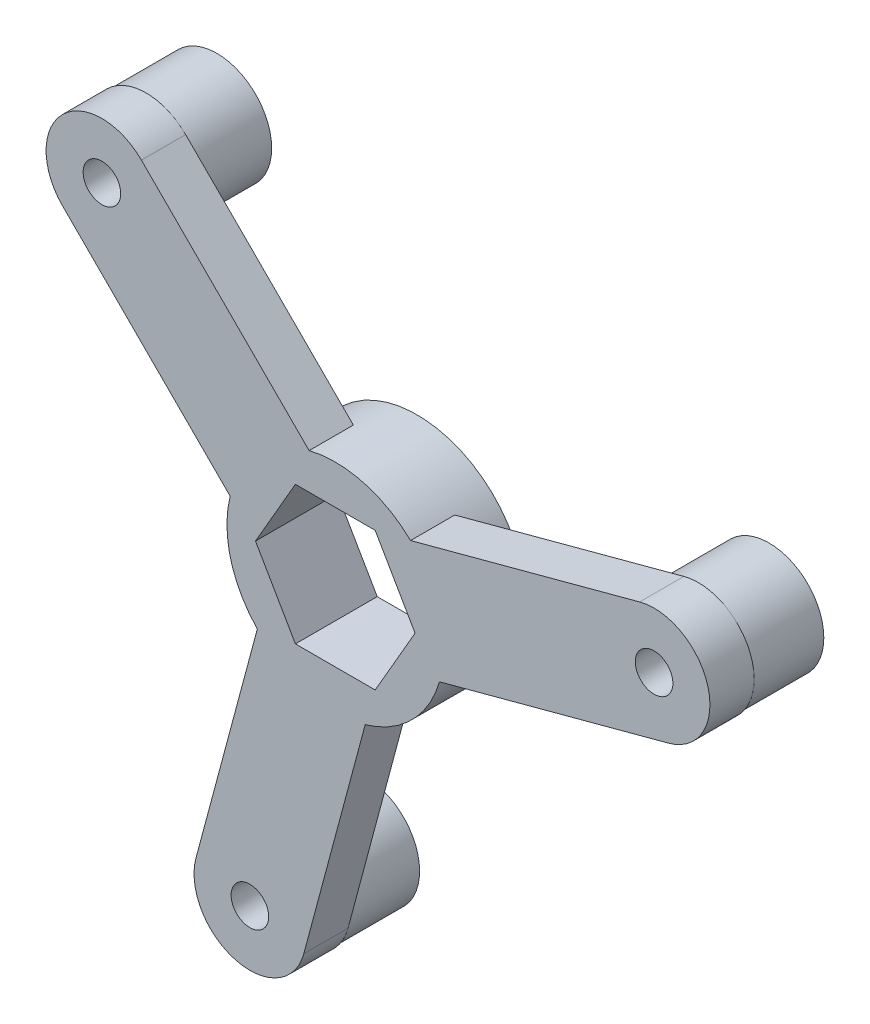
ISO-10303-21;
HEADER;
FILE_DESCRIPTION(('STEP AP214'),'2;1');
FILE_NAME('part.step','',(''),(''),'','','');
FILE_SCHEMA(('AUTOMOTIVE_DESIGN { 1 0 10303 214 1 1 1 1 }'));
ENDSEC;
DATA;
#1=APPLICATION_CONTEXT('core data for automotive mechanical design processes');
#2=APPLICATION_PROTOCOL_DEFINITION('international standard','automotive_design',2000,#1);
#3=PRODUCT_CONTEXT('',#1,'mechanical');
#4=PRODUCT('Part','Part','',(#3));
#5=PRODUCT_RELATED_PRODUCT_CATEGORY('part','',(#4));
#6=PRODUCT_DEFINITION_FORMATION('','',#4);
#7=PRODUCT_DEFINITION_CONTEXT('part definition',#1,'design');
#8=PRODUCT_DEFINITION('design','',#6,#7);
#9=PRODUCT_DEFINITION_SHAPE('','',#8);
#10=(LENGTH_UNIT() NAMED_UNIT(*) SI_UNIT(.MILLI.,.METRE.));
#11=(NAMED_UNIT(*) PLANE_ANGLE_UNIT() SI_UNIT($,.RADIAN.));
#12=(NAMED_UNIT(*) SI_UNIT($,.STERADIAN.) SOLID_ANGLE_UNIT());
#13=UNCERTAINTY_MEASURE_WITH_UNIT(LENGTH_MEASURE(1.E-05),#10,'distance_accuracy_value','');
#14=(GEOMETRIC_REPRESENTATION_CONTEXT(3) GLOBAL_UNCERTAINTY_ASSIGNED_CONTEXT((#13)) GLOBAL_UNIT_ASSIGNED_CONTEXT((#10,
#11,#12)) REPRESENTATION_CONTEXT('',''));
#15=CARTESIAN_POINT('',(0.,0.,0.));
#16=DIRECTION('',(0.,0.,1.));
#17=DIRECTION('',(1.,0.,0.));
#18=AXIS2_PLACEMENT_3D('',#15,#16,#17);
#19=CARTESIAN_POINT('',(0.,0.,10.4));
#20=DIRECTION('',(0.,0.,1.));
#21=DIRECTION('',(1.,0.,0.));
#22=AXIS2_PLACEMENT_3D('',#19,#20,#21);
#23=PLANE('',#22);
#24=CARTESIAN_POINT('',(28.8328859147287,7.72574849631024,10.4));
#25=DIRECTION('',(0.,0.,1.));
#26=DIRECTION('',(1.,0.,0.));
#27=AXIS2_PLACEMENT_3D('',#24,#25,#26);
#28=CIRCLE('',#27,1.7);
#29=CARTESIAN_POINT('',(30.5328859147287,7.72574849631024,10.4));
#30=VERTEX_POINT('',#29);
#31=EDGE_CURVE('E180',#30,#30,#28,.F.);
#32=ORIENTED_EDGE('',*,*,#31,.T.);
#33=EDGE_LOOP('',(#32));
#34=FACE_BOUND('',#33,.T.);
#35=CARTESIAN_POINT('',(-21.1071374184184,21.1071374184184,10.4));
#36=DIRECTION('',(0.,0.,1.));
#37=DIRECTION('',(1.,0.,0.));
#38=AXIS2_PLACEMENT_3D('',#35,#36,#37);
#39=CIRCLE('',#38,1.7);
#40=CARTESIAN_POINT('',(-19.4071374184184,21.1071374184184,10.4));
#41=VERTEX_POINT('',#40);
#42=EDGE_CURVE('E311',#41,#41,#39,.F.);
#43=ORIENTED_EDGE('',*,*,#42,.T.);
#44=EDGE_LOOP('',(#43));
#45=FACE_BOUND('',#44,.T.);
#46=CARTESIAN_POINT('',(-7.72574849631024,-28.8328859147287,10.4));
#47=DIRECTION('',(0.,0.,1.));
#48=DIRECTION('',(1.,0.,0.));
#49=AXIS2_PLACEMENT_3D('',#46,#47,#48);
#50=CIRCLE('',#49,1.7);
#51=CARTESIAN_POINT('',(-6.02574849631024,-28.8328859147287,10.4));
#52=VERTEX_POINT('',#51);
#53=EDGE_CURVE('E308',#52,#52,#50,.F.);
#54=ORIENTED_EDGE('',*,*,#53,.T.);
#55=EDGE_LOOP('',(#54));
#56=FACE_BOUND('',#55,.T.);
#57=CARTESIAN_POINT('',(0.,0.,10.4));
#58=DIRECTION('',(0.,0.,1.));
#59=DIRECTION('',(1.,0.,0.));
#60=AXIS2_PLACEMENT_3D('',#57,#58,#59);
#61=CIRCLE('',#60,9.8);
#62=CARTESIAN_POINT('',(-9.50963911344081,2.36786062345668,10.4));
#63=VERTEX_POINT('',#62);
#64=CARTESIAN_POINT('',(-7.05165874133353,-6.80544700925475,10.4));
#65=VERTEX_POINT('',#64);
#66=EDGE_CURVE('E284',#63,#65,#61,.T.);
#67=ORIENTED_EDGE('',*,*,#66,.T.);
#68=DIRECTION('',(-0.258819045102521,-0.965925826289068,0.));
#69=VECTOR('',#68,1.);
#70=CARTESIAN_POINT('',(-12.60367391907,-27.525849736961,10.4));
#71=LINE('',#70,#69);
#72=CARTESIAN_POINT('',(-12.60367391907,-27.525849736961,10.4));
#73=VERTEX_POINT('',#72);
#74=EDGE_CURVE('E191',#65,#73,#71,.T.);
#75=ORIENTED_EDGE('',*,*,#74,.T.);
#76=CARTESIAN_POINT('',(-7.72574849631024,-28.8328859147287,10.4));
#77=DIRECTION('',(0.,0.,1.));
#78=DIRECTION('',(-1.,0.,0.));
#79=AXIS2_PLACEMENT_3D('',#76,#77,#78);
#80=CIRCLE('',#79,5.05);
#81=CARTESIAN_POINT('',(-2.84782307355045,-30.1399220924964,10.4));
#82=VERTEX_POINT('',#81);
#83=EDGE_CURVE('E196',#73,#82,#80,.T.);
#84=ORIENTED_EDGE('',*,*,#83,.T.);
#85=DIRECTION('',(0.258819045102521,0.965925826289068,0.));
#86=VECTOR('',#85,1.);
#87=CARTESIAN_POINT('',(2.94648829868223,-8.5152576564499,10.4));
#88=LINE('',#87,#86);
#89=CARTESIAN_POINT('',(2.70419210418606,-9.41951936479021,10.4));
#90=VERTEX_POINT('',#89);
#91=EDGE_CURVE('E198',#82,#90,#88,.T.);
#92=ORIENTED_EDGE('',*,*,#91,.T.);
#93=CARTESIAN_POINT('',(9.41951936479022,-2.70419210418606,10.4));
#94=VERTEX_POINT('',#93);
#95=EDGE_CURVE('E288',#90,#94,#61,.T.);
#96=ORIENTED_EDGE('',*,*,#95,.T.);
#97=DIRECTION('',(0.965925826289068,0.258819045102521,0.));
#98=VECTOR('',#97,1.);
#99=CARTESIAN_POINT('',(30.1399220924964,2.84782307355045,10.4));
#100=LINE('',#99,#98);
#101=CARTESIAN_POINT('',(30.1399220924964,2.84782307355045,10.4));
#102=VERTEX_POINT('',#101);
#103=EDGE_CURVE('E257',#94,#102,#100,.T.);
#104=ORIENTED_EDGE('',*,*,#103,.T.);
#105=CARTESIAN_POINT('',(28.8328859147287,7.72574849631025,10.4));
#106=DIRECTION('',(0.,0.,1.));
#107=DIRECTION('',(-1.,0.,0.));
#108=AXIS2_PLACEMENT_3D('',#105,#106,#107);
#109=CIRCLE('',#108,5.05);
#110=CARTESIAN_POINT('',(27.525849736961,12.60367391907,10.4));
#111=VERTEX_POINT('',#110);
#112=EDGE_CURVE('E259',#102,#111,#109,.T.);
#113=ORIENTED_EDGE('',*,*,#112,.T.);
#114=DIRECTION('',(-0.965925826289068,-0.258819045102521,0.));
#115=VECTOR('',#114,1.);
#116=CARTESIAN_POINT('',(5.90118530091444,6.80936254683736,10.4));
#117=LINE('',#116,#115);
#118=CARTESIAN_POINT('',(6.80544700925476,7.05165874133353,10.4));
#119=VERTEX_POINT('',#118);
#120=EDGE_CURVE('E261',#111,#119,#117,.T.);
#121=ORIENTED_EDGE('',*,*,#120,.T.);
#122=CARTESIAN_POINT('',(-2.36786062345667,9.50963911344081,10.4));
#123=VERTEX_POINT('',#122);
#124=EDGE_CURVE('E281',#119,#123,#61,.T.);
#125=ORIENTED_EDGE('',*,*,#124,.T.);
#126=DIRECTION('',(-0.707106781186548,0.707106781186548,0.));
#127=VECTOR('',#126,1.);
#128=CARTESIAN_POINT('',(-17.5362481734264,24.6780266634105,10.4));
#129=LINE('',#128,#127);
#130=CARTESIAN_POINT('',(-17.5362481734264,24.6780266634105,10.4));
#131=VERTEX_POINT('',#130);
#132=EDGE_CURVE('E224',#123,#131,#129,.T.);
#133=ORIENTED_EDGE('',*,*,#132,.T.);
#134=CARTESIAN_POINT('',(-21.1071374184184,21.1071374184184,10.4));
#135=DIRECTION('',(0.,0.,1.));
#136=DIRECTION('',(-1.,0.,0.));
#137=AXIS2_PLACEMENT_3D('',#134,#135,#136);
#138=CIRCLE('',#137,5.05);
#139=CARTESIAN_POINT('',(-24.6780266634105,17.5362481734264,10.4));
#140=VERTEX_POINT('',#139);
#141=EDGE_CURVE('E227',#131,#140,#138,.T.);
#142=ORIENTED_EDGE('',*,*,#141,.T.);
#143=DIRECTION('',(0.707106781186548,-0.707106781186548,0.));
#144=VECTOR('',#143,1.);
#145=CARTESIAN_POINT('',(-8.84767359959668,1.70589510961255,10.4));
#146=LINE('',#145,#144);
#147=EDGE_CURVE('E229',#140,#63,#146,.T.);
#148=ORIENTED_EDGE('',*,*,#147,.T.);
#149=EDGE_LOOP('',(#67,#75,#84,#92,#96,#104,#113,#121,#125,#133,#142,#148));
#150=FACE_BOUND('',#149,.T.);
#151=DIRECTION('',(0.5,-0.866025403784439,0.));
#152=VECTOR('',#151,1.);
#153=CARTESIAN_POINT('',(5.41265877365274,3.125,10.4));
#154=LINE('',#153,#152);
#155=CARTESIAN_POINT('',(3.60843918243516,6.25,10.4));
#156=VERTEX_POINT('',#155);
#157=CARTESIAN_POINT('',(7.21687836487032,0.,10.4));
#158=VERTEX_POINT('',#157);
#159=EDGE_CURVE('E181',#156,#158,#154,.T.);
#160=ORIENTED_EDGE('',*,*,#159,.T.);
#161=DIRECTION('',(-0.5,-0.866025403784439,0.));
#162=VECTOR('',#161,1.);
#163=CARTESIAN_POINT('',(5.41265877365274,-3.125,10.4));
#164=LINE('',#163,#162);
#165=CARTESIAN_POINT('',(3.60843918243516,-6.25,10.4));
#166=VERTEX_POINT('',#165);
#167=EDGE_CURVE('E173',#158,#166,#164,.T.);
#168=ORIENTED_EDGE('',*,*,#167,.T.);
#169=DIRECTION('',(-1.,0.,0.));
#170=VECTOR('',#169,1.);
#171=CARTESIAN_POINT('',(0.,-6.25,10.4));
#172=LINE('',#171,#170);
#173=CARTESIAN_POINT('',(-3.60843918243516,-6.25,10.4));
#174=VERTEX_POINT('',#173);
#175=EDGE_CURVE('E162',#166,#174,#172,.T.);
#176=ORIENTED_EDGE('',*,*,#175,.T.);
#177=DIRECTION('',(-0.5,0.866025403784439,0.));
#178=VECTOR('',#177,1.);
#179=CARTESIAN_POINT('',(-5.41265877365274,-3.125,10.4));
#180=LINE('',#179,#178);
#181=CARTESIAN_POINT('',(-7.21687836487032,0.,10.4));
#182=VERTEX_POINT('',#181);
#183=EDGE_CURVE('E170',#174,#182,#180,.T.);
#184=ORIENTED_EDGE('',*,*,#183,.T.);
#185=DIRECTION('',(0.5,0.866025403784439,0.));
#186=VECTOR('',#185,1.);
#187=CARTESIAN_POINT('',(-5.41265877365274,3.125,10.4));
#188=LINE('',#187,#186);
#189=CARTESIAN_POINT('',(-3.60843918243516,6.25,10.4));
#190=VERTEX_POINT('',#189);
#191=EDGE_CURVE('E334',#182,#190,#188,.T.);
#192=ORIENTED_EDGE('',*,*,#191,.T.);
#193=DIRECTION('',(1.,0.,0.));
#194=VECTOR('',#193,1.);
#195=CARTESIAN_POINT('',(0.,6.25,10.4));
#196=LINE('',#195,#194);
#197=EDGE_CURVE('E190',#190,#156,#196,.T.);
#198=ORIENTED_EDGE('',*,*,#197,.T.);
#199=EDGE_LOOP('',(#160,#168,#176,#184,#192,#198));
#200=FACE_BOUND('',#199,.T.);
#201=ADVANCED_FACE('F39',(#34,#45,#56,#150,#200),#23,.T.);
#202=CARTESIAN_POINT('',(0.,0.,3.));
#203=DIRECTION('',(0.,0.,1.));
#204=DIRECTION('',(1.,0.,0.));
#205=AXIS2_PLACEMENT_3D('',#202,#203,#204);
#206=PLANE('',#205);
#207=CARTESIAN_POINT('',(0.,0.,3.));
#208=DIRECTION('',(0.,0.,1.));
#209=DIRECTION('',(1.,0.,0.));
#210=AXIS2_PLACEMENT_3D('',#207,#208,#209);
#211=CIRCLE('',#210,9.8);
#212=CARTESIAN_POINT('',(9.8,0.,3.));
#213=VERTEX_POINT('',#212);
#214=EDGE_CURVE('E278',#213,#213,#211,.T.);
#215=ORIENTED_EDGE('',*,*,#214,.F.);
#216=EDGE_LOOP('',(#215));
#217=FACE_BOUND('',#216,.T.);
#218=DIRECTION('',(-0.5,-0.866025403784439,0.));
#219=VECTOR('',#218,1.);
#220=CARTESIAN_POINT('',(5.41265877365274,-3.125,3.));
#221=LINE('',#220,#219);
#222=CARTESIAN_POINT('',(7.21687836487032,0.,3.));
#223=VERTEX_POINT('',#222);
#224=CARTESIAN_POINT('',(3.60843918243516,-6.25,3.));
#225=VERTEX_POINT('',#224);
#226=EDGE_CURVE('E11',#223,#225,#221,.T.);
#227=ORIENTED_EDGE('',*,*,#226,.F.);
#228=DIRECTION('',(0.5,-0.866025403784439,0.));
#229=VECTOR('',#228,1.);
#230=CARTESIAN_POINT('',(5.41265877365274,3.125,3.));
#231=LINE('',#230,#229);
#232=CARTESIAN_POINT('',(3.60843918243516,6.25,3.));
#233=VERTEX_POINT('',#232);
#234=EDGE_CURVE('E48',#233,#223,#231,.T.);
#235=ORIENTED_EDGE('',*,*,#234,.F.);
#236=DIRECTION('',(1.,0.,0.));
#237=VECTOR('',#236,1.);
#238=CARTESIAN_POINT('',(0.,6.25,3.));
#239=LINE('',#238,#237);
#240=CARTESIAN_POINT('',(-3.60843918243516,6.25,3.));
#241=VERTEX_POINT('',#240);
#242=EDGE_CURVE('E303',#241,#233,#239,.T.);
#243=ORIENTED_EDGE('',*,*,#242,.F.);
#244=DIRECTION('',(0.5,0.866025403784439,0.));
#245=VECTOR('',#244,1.);
#246=CARTESIAN_POINT('',(-5.41265877365274,3.125,3.));
#247=LINE('',#246,#245);
#248=CARTESIAN_POINT('',(-7.21687836487032,0.,3.));
#249=VERTEX_POINT('',#248);
#250=EDGE_CURVE('E301',#249,#241,#247,.T.);
#251=ORIENTED_EDGE('',*,*,#250,.F.);
#252=DIRECTION('',(-0.5,0.866025403784439,0.));
#253=VECTOR('',#252,1.);
#254=CARTESIAN_POINT('',(-5.41265877365274,-3.125,3.));
#255=LINE('',#254,#253);
#256=CARTESIAN_POINT('',(-3.60843918243516,-6.25,3.));
#257=VERTEX_POINT('',#256);
#258=EDGE_CURVE('E299',#257,#249,#255,.T.);
#259=ORIENTED_EDGE('',*,*,#258,.F.);
#260=DIRECTION('',(-1.,0.,0.));
#261=VECTOR('',#260,1.);
#262=CARTESIAN_POINT('',(0.,-6.25,3.));
#263=LINE('',#262,#261);
#264=EDGE_CURVE('E300',#225,#257,#263,.T.);
#265=ORIENTED_EDGE('',*,*,#264,.F.);
#266=EDGE_LOOP('',(#227,#235,#243,#251,#259,#265));
#267=FACE_BOUND('',#266,.T.);
#268=ADVANCED_FACE('F347',(#217,#267),#206,.F.);
#269=CARTESIAN_POINT('',(0.,0.,10.4));
#270=DIRECTION('',(0.,0.,-1.));
#271=DIRECTION('',(-1.,0.,0.));
#272=AXIS2_PLACEMENT_3D('',#269,#270,#271);
#273=CYLINDRICAL_SURFACE('',#272,9.8);
#274=ORIENTED_EDGE('',*,*,#214,.T.);
#275=EDGE_LOOP('',(#274));
#276=FACE_BOUND('',#275,.T.);
#277=DIRECTION('',(0.,0.,-1.));
#278=VECTOR('',#277,1.);
#279=CARTESIAN_POINT('',(-7.05165874133353,-6.80544700925475,10.4));
#280=LINE('',#279,#278);
#281=CARTESIAN_POINT('',(-7.05165874133353,-6.80544700925475,6.4));
#282=VERTEX_POINT('',#281);
#283=EDGE_CURVE('E213',#65,#282,#280,.T.);
#284=ORIENTED_EDGE('',*,*,#283,.F.);
#285=ORIENTED_EDGE('',*,*,#66,.F.);
#286=DIRECTION('',(0.,0.,-1.));
#287=VECTOR('',#286,1.);
#288=CARTESIAN_POINT('',(-9.50963911344081,2.36786062345668,10.4));
#289=LINE('',#288,#287);
#290=CARTESIAN_POINT('',(-9.50963911344081,2.36786062345668,6.4));
#291=VERTEX_POINT('',#290);
#292=EDGE_CURVE('E242',#291,#63,#289,.F.);
#293=ORIENTED_EDGE('',*,*,#292,.F.);
#294=CARTESIAN_POINT('',(0.,0.,6.4));
#295=DIRECTION('',(0.,0.,-1.));
#296=DIRECTION('',(-1.,0.,0.));
#297=AXIS2_PLACEMENT_3D('',#294,#295,#296);
#298=CIRCLE('',#297,9.8);
#299=CARTESIAN_POINT('',(-2.36786062345668,9.50963911344081,6.4));
#300=VERTEX_POINT('',#299);
#301=EDGE_CURVE('E293',#291,#300,#298,.T.);
#302=ORIENTED_EDGE('',*,*,#301,.T.);
#303=DIRECTION('',(0.,0.,-1.));
#304=VECTOR('',#303,1.);
#305=CARTESIAN_POINT('',(-2.36786062345668,9.50963911344081,10.4));
#306=LINE('',#305,#304);
#307=EDGE_CURVE('E246',#123,#300,#306,.T.);
#308=ORIENTED_EDGE('',*,*,#307,.F.);
#309=ORIENTED_EDGE('',*,*,#124,.F.);
#310=DIRECTION('',(0.,0.,-1.));
#311=VECTOR('',#310,1.);
#312=CARTESIAN_POINT('',(6.80544700925475,7.05165874133353,10.4));
#313=LINE('',#312,#311);
#314=CARTESIAN_POINT('',(6.80544700925475,7.05165874133353,6.4));
#315=VERTEX_POINT('',#314);
#316=EDGE_CURVE('E273',#315,#119,#313,.F.);
#317=ORIENTED_EDGE('',*,*,#316,.F.);
#318=CARTESIAN_POINT('',(0.,0.,6.4));
#319=DIRECTION('',(0.,0.,-1.));
#320=DIRECTION('',(-1.,0.,0.));
#321=AXIS2_PLACEMENT_3D('',#318,#319,#320);
#322=CIRCLE('',#321,9.8);
#323=CARTESIAN_POINT('',(9.41951936479021,-2.70419210418606,6.4));
#324=VERTEX_POINT('',#323);
#325=EDGE_CURVE('E283',#315,#324,#322,.T.);
#326=ORIENTED_EDGE('',*,*,#325,.T.);
#327=DIRECTION('',(0.,0.,-1.));
#328=VECTOR('',#327,1.);
#329=CARTESIAN_POINT('',(9.41951936479021,-2.70419210418606,10.4));
#330=LINE('',#329,#328);
#331=EDGE_CURVE('E280',#94,#324,#330,.T.);
#332=ORIENTED_EDGE('',*,*,#331,.F.);
#333=ORIENTED_EDGE('',*,*,#95,.F.);
#334=DIRECTION('',(0.,0.,-1.));
#335=VECTOR('',#334,1.);
#336=CARTESIAN_POINT('',(2.70419210418606,-9.41951936479021,10.4));
#337=LINE('',#336,#335);
#338=CARTESIAN_POINT('',(2.70419210418606,-9.41951936479021,6.4));
#339=VERTEX_POINT('',#338);
#340=EDGE_CURVE('E214',#339,#90,#337,.F.);
#341=ORIENTED_EDGE('',*,*,#340,.F.);
#342=CARTESIAN_POINT('',(0.,0.,6.4));
#343=DIRECTION('',(0.,0.,-1.));
#344=DIRECTION('',(-1.,0.,0.));
#345=AXIS2_PLACEMENT_3D('',#342,#343,#344);
#346=CIRCLE('',#345,9.8);
#347=EDGE_CURVE('E295',#339,#282,#346,.T.);
#348=ORIENTED_EDGE('',*,*,#347,.T.);
#349=EDGE_LOOP('',(#284,#285,#293,#302,#308,#309,#317,#326,#332,#333,#341,#348));
#350=FACE_BOUND('',#349,.T.);
#351=ADVANCED_FACE('F41',(#276,#350),#273,.T.);
#352=CARTESIAN_POINT('',(30.1399220924964,2.84782307355045,10.4));
#353=DIRECTION('',(-0.258819045102521,0.965925826289068,0.));
#354=DIRECTION('',(-0.965925826289068,-0.258819045102521,0.));
#355=AXIS2_PLACEMENT_3D('',#352,#353,#354);
#356=PLANE('',#355);
#357=ORIENTED_EDGE('',*,*,#103,.F.);
#358=ORIENTED_EDGE('',*,*,#331,.T.);
#359=DIRECTION('',(0.965925826289068,0.258819045102521,0.));
#360=VECTOR('',#359,1.);
#361=CARTESIAN_POINT('',(30.1399220924964,2.84782307355045,6.4));
#362=LINE('',#361,#360);
#363=CARTESIAN_POINT('',(30.1399220924964,2.84782307355045,6.4));
#364=VERTEX_POINT('',#363);
#365=EDGE_CURVE('E254',#324,#364,#362,.T.);
#366=ORIENTED_EDGE('',*,*,#365,.T.);
#367=DIRECTION('',(0.,0.,-1.));
#368=VECTOR('',#367,1.);
#369=CARTESIAN_POINT('',(30.1399220924964,2.84782307355045,10.4));
#370=LINE('',#369,#368);
#371=EDGE_CURVE('E275',#102,#364,#370,.T.);
#372=ORIENTED_EDGE('',*,*,#371,.F.);
#373=EDGE_LOOP('',(#357,#358,#366,#372));
#374=FACE_BOUND('',#373,.T.);
#375=ADVANCED_FACE('F373',(#374),#356,.F.);
#376=CARTESIAN_POINT('',(5.90118530091444,6.80936254683736,10.4));
#377=DIRECTION('',(0.258819045102521,-0.965925826289068,0.));
#378=DIRECTION('',(0.965925826289068,0.258819045102521,0.));
#379=AXIS2_PLACEMENT_3D('',#376,#377,#378);
#380=PLANE('',#379);
#381=DIRECTION('',(-0.965925826289068,-0.258819045102521,0.));
#382=VECTOR('',#381,1.);
#383=CARTESIAN_POINT('',(5.90118530091444,6.80936254683736,6.4));
#384=LINE('',#383,#382);
#385=CARTESIAN_POINT('',(27.525849736961,12.60367391907,6.4));
#386=VERTEX_POINT('',#385);
#387=EDGE_CURVE('E256',#386,#315,#384,.T.);
#388=ORIENTED_EDGE('',*,*,#387,.T.);
#389=ORIENTED_EDGE('',*,*,#316,.T.);
#390=ORIENTED_EDGE('',*,*,#120,.F.);
#391=DIRECTION('',(0.,0.,-1.));
#392=VECTOR('',#391,1.);
#393=CARTESIAN_POINT('',(27.525849736961,12.60367391907,10.4));
#394=LINE('',#393,#392);
#395=EDGE_CURVE('E263',#111,#386,#394,.T.);
#396=ORIENTED_EDGE('',*,*,#395,.T.);
#397=EDGE_LOOP('',(#388,#389,#390,#396));
#398=FACE_BOUND('',#397,.T.);
#399=ADVANCED_FACE('F376',(#398),#380,.F.);
#400=CARTESIAN_POINT('',(28.8328859147287,7.72574849631025,10.4));
#401=DIRECTION('',(0.,0.,-1.));
#402=DIRECTION('',(-1.,0.,0.));
#403=AXIS2_PLACEMENT_3D('',#400,#401,#402);
#404=CYLINDRICAL_SURFACE('',#403,5.05);
#405=CARTESIAN_POINT('',(28.8328859147287,7.72574849631025,6.4));
#406=DIRECTION('',(0.,0.,1.));
#407=DIRECTION('',(-1.,0.,0.));
#408=AXIS2_PLACEMENT_3D('',#405,#406,#407);
#409=CIRCLE('',#408,5.05);
#410=EDGE_CURVE('E268',#364,#386,#409,.T.);
#411=ORIENTED_EDGE('',*,*,#410,.T.);
#412=ORIENTED_EDGE('',*,*,#395,.F.);
#413=ORIENTED_EDGE('',*,*,#112,.F.);
#414=ORIENTED_EDGE('',*,*,#371,.T.);
#415=EDGE_LOOP('',(#411,#412,#413,#414));
#416=FACE_BOUND('',#415,.T.);
#417=ADVANCED_FACE('F377',(#416),#404,.T.);
#418=CARTESIAN_POINT('',(7.20822147868217,1.93143712407756,6.4));
#419=DIRECTION('',(0.,0.,-1.));
#420=DIRECTION('',(-1.,0.,0.));
#421=AXIS2_PLACEMENT_3D('',#418,#419,#420);
#422=PLANE('',#421);
#423=CARTESIAN_POINT('',(28.8328859147287,7.72574849631024,6.4));
#424=DIRECTION('',(0.,0.,1.));
#425=DIRECTION('',(1.,0.,0.));
#426=AXIS2_PLACEMENT_3D('',#423,#424,#425);
#427=CIRCLE('',#426,4.95);
#428=CARTESIAN_POINT('',(33.7828859147287,7.72574849631024,6.4));
#429=VERTEX_POINT('',#428);
#430=EDGE_CURVE('E249',#429,#429,#427,.T.);
#431=ORIENTED_EDGE('',*,*,#430,.T.);
#432=EDGE_LOOP('',(#431));
#433=FACE_BOUND('',#432,.T.);
#434=ORIENTED_EDGE('',*,*,#325,.F.);
#435=ORIENTED_EDGE('',*,*,#387,.F.);
#436=ORIENTED_EDGE('',*,*,#410,.F.);
#437=ORIENTED_EDGE('',*,*,#365,.F.);
#438=EDGE_LOOP('',(#434,#435,#436,#437));
#439=FACE_BOUND('',#438,.T.);
#440=ADVANCED_FACE('F382',(#433,#439),#422,.T.);
#441=CARTESIAN_POINT('',(28.8328859147287,7.72574849631024,6.4));
#442=DIRECTION('',(0.,0.,-1.));
#443=DIRECTION('',(-1.,0.,0.));
#444=AXIS2_PLACEMENT_3D('',#441,#442,#443);
#445=CYLINDRICAL_SURFACE('',#444,4.95);
#446=ORIENTED_EDGE('',*,*,#430,.F.);
#447=EDGE_LOOP('',(#446));
#448=FACE_BOUND('',#447,.T.);
#449=CARTESIAN_POINT('',(28.8328859147287,7.72574849631024,0.));
#450=DIRECTION('',(0.,0.,1.));
#451=DIRECTION('',(1.,0.,0.));
#452=AXIS2_PLACEMENT_3D('',#449,#450,#451);
#453=CIRCLE('',#452,4.95);
#454=CARTESIAN_POINT('',(33.7828859147287,7.72574849631024,0.));
#455=VERTEX_POINT('',#454);
#456=EDGE_CURVE('E248',#455,#455,#453,.T.);
#457=ORIENTED_EDGE('',*,*,#456,.T.);
#458=EDGE_LOOP('',(#457));
#459=FACE_BOUND('',#458,.T.);
#460=ADVANCED_FACE('F389',(#448,#459),#445,.T.);
#461=CARTESIAN_POINT('',(28.8328859147287,7.72574849631024,0.));
#462=DIRECTION('',(0.,0.,1.));
#463=DIRECTION('',(1.,0.,0.));
#464=AXIS2_PLACEMENT_3D('',#461,#462,#463);
#465=PLANE('',#464);
#466=CARTESIAN_POINT('',(28.8328859147287,7.72574849631024,0.));
#467=DIRECTION('',(0.,0.,1.));
#468=DIRECTION('',(1.,0.,0.));
#469=AXIS2_PLACEMENT_3D('',#466,#467,#468);
#470=CIRCLE('',#469,1.7);
#471=CARTESIAN_POINT('',(30.5328859147287,7.72574849631024,0.));
#472=VERTEX_POINT('',#471);
#473=EDGE_CURVE('E43',#472,#472,#470,.F.);
#474=ORIENTED_EDGE('',*,*,#473,.F.);
#475=EDGE_LOOP('',(#474));
#476=FACE_BOUND('',#475,.T.);
#477=ORIENTED_EDGE('',*,*,#456,.F.);
#478=EDGE_LOOP('',(#477));
#479=FACE_BOUND('',#478,.T.);
#480=ADVANCED_FACE('F395',(#476,#479),#465,.F.);
#481=CARTESIAN_POINT('',(-17.5362481734264,24.6780266634105,10.4));
#482=DIRECTION('',(-0.707106781186548,-0.707106781186547,0.));
#483=DIRECTION('',(0.707106781186547,-0.707106781186548,0.));
#484=AXIS2_PLACEMENT_3D('',#481,#482,#483);
#485=PLANE('',#484);
#486=ORIENTED_EDGE('',*,*,#132,.F.);
#487=ORIENTED_EDGE('',*,*,#307,.T.);
#488=DIRECTION('',(-0.707106781186548,0.707106781186548,0.));
#489=VECTOR('',#488,1.);
#490=CARTESIAN_POINT('',(-17.5362481734264,24.6780266634105,6.4));
#491=LINE('',#490,#489);
#492=CARTESIAN_POINT('',(-17.5362481734264,24.6780266634105,6.4));
#493=VERTEX_POINT('',#492);
#494=EDGE_CURVE('E225',#300,#493,#491,.T.);
#495=ORIENTED_EDGE('',*,*,#494,.T.);
#496=DIRECTION('',(0.,0.,-1.));
#497=VECTOR('',#496,1.);
#498=CARTESIAN_POINT('',(-17.5362481734264,24.6780266634105,10.4));
#499=LINE('',#498,#497);
#500=EDGE_CURVE('E241',#131,#493,#499,.T.);
#501=ORIENTED_EDGE('',*,*,#500,.F.);
#502=EDGE_LOOP('',(#486,#487,#495,#501));
#503=FACE_BOUND('',#502,.T.);
#504=ADVANCED_FACE('F394',(#503),#485,.F.);
#505=CARTESIAN_POINT('',(-8.84767359959668,1.70589510961255,10.4));
#506=DIRECTION('',(0.707106781186547,0.707106781186548,0.));
#507=DIRECTION('',(-0.707106781186548,0.707106781186547,0.));
#508=AXIS2_PLACEMENT_3D('',#505,#506,#507);
#509=PLANE('',#508);
#510=DIRECTION('',(0.707106781186548,-0.707106781186548,0.));
#511=VECTOR('',#510,1.);
#512=CARTESIAN_POINT('',(-8.84767359959668,1.70589510961255,6.4));
#513=LINE('',#512,#511);
#514=CARTESIAN_POINT('',(-24.6780266634105,17.5362481734264,6.4));
#515=VERTEX_POINT('',#514);
#516=EDGE_CURVE('E226',#515,#291,#513,.T.);
#517=ORIENTED_EDGE('',*,*,#516,.T.);
#518=ORIENTED_EDGE('',*,*,#292,.T.);
#519=ORIENTED_EDGE('',*,*,#147,.F.);
#520=DIRECTION('',(0.,0.,-1.));
#521=VECTOR('',#520,1.);
#522=CARTESIAN_POINT('',(-24.6780266634105,17.5362481734264,10.4));
#523=LINE('',#522,#521);
#524=EDGE_CURVE('E231',#140,#515,#523,.T.);
#525=ORIENTED_EDGE('',*,*,#524,.T.);
#526=EDGE_LOOP('',(#517,#518,#519,#525));
#527=FACE_BOUND('',#526,.T.);
#528=ADVANCED_FACE('F397',(#527),#509,.F.);
#529=CARTESIAN_POINT('',(-21.1071374184184,21.1071374184184,10.4));
#530=DIRECTION('',(0.,0.,-1.));
#531=DIRECTION('',(-1.,0.,0.));
#532=AXIS2_PLACEMENT_3D('',#529,#530,#531);
#533=CYLINDRICAL_SURFACE('',#532,5.05);
#534=CARTESIAN_POINT('',(-21.1071374184184,21.1071374184184,6.4));
#535=DIRECTION('',(0.,0.,1.));
#536=DIRECTION('',(-1.,0.,0.));
#537=AXIS2_PLACEMENT_3D('',#534,#535,#536);
#538=CIRCLE('',#537,5.05);
#539=EDGE_CURVE('E232',#493,#515,#538,.T.);
#540=ORIENTED_EDGE('',*,*,#539,.T.);
#541=ORIENTED_EDGE('',*,*,#524,.F.);
#542=ORIENTED_EDGE('',*,*,#141,.F.);
#543=ORIENTED_EDGE('',*,*,#500,.T.);
#544=EDGE_LOOP('',(#540,#541,#542,#543));
#545=FACE_BOUND('',#544,.T.);
#546=ADVANCED_FACE('F402',(#545),#533,.T.);
#547=CARTESIAN_POINT('',(-5.27678435460461,5.27678435460461,6.4));
#548=DIRECTION('',(0.,0.,-1.));
#549=DIRECTION('',(-1.,0.,0.));
#550=AXIS2_PLACEMENT_3D('',#547,#548,#549);
#551=PLANE('',#550);
#552=CARTESIAN_POINT('',(-21.1071374184184,21.1071374184184,6.4));
#553=DIRECTION('',(0.,0.,1.));
#554=DIRECTION('',(1.,0.,0.));
#555=AXIS2_PLACEMENT_3D('',#552,#553,#554);
#556=CIRCLE('',#555,4.95);
#557=CARTESIAN_POINT('',(-16.1571374184184,21.1071374184184,6.4));
#558=VERTEX_POINT('',#557);
#559=EDGE_CURVE('E218',#558,#558,#556,.T.);
#560=ORIENTED_EDGE('',*,*,#559,.T.);
#561=EDGE_LOOP('',(#560));
#562=FACE_BOUND('',#561,.T.);
#563=ORIENTED_EDGE('',*,*,#301,.F.);
#564=ORIENTED_EDGE('',*,*,#516,.F.);
#565=ORIENTED_EDGE('',*,*,#539,.F.);
#566=ORIENTED_EDGE('',*,*,#494,.F.);
#567=EDGE_LOOP('',(#563,#564,#565,#566));
#568=FACE_BOUND('',#567,.T.);
#569=ADVANCED_FACE('F404',(#562,#568),#551,.T.);
#570=CARTESIAN_POINT('',(-21.1071374184184,21.1071374184184,6.4));
#571=DIRECTION('',(0.,0.,-1.));
#572=DIRECTION('',(-1.,0.,0.));
#573=AXIS2_PLACEMENT_3D('',#570,#571,#572);
#574=CYLINDRICAL_SURFACE('',#573,4.95);
#575=ORIENTED_EDGE('',*,*,#559,.F.);
#576=EDGE_LOOP('',(#575));
#577=FACE_BOUND('',#576,.T.);
#578=CARTESIAN_POINT('',(-21.1071374184184,21.1071374184184,0.));
#579=DIRECTION('',(0.,0.,1.));
#580=DIRECTION('',(1.,0.,0.));
#581=AXIS2_PLACEMENT_3D('',#578,#579,#580);
#582=CIRCLE('',#581,4.95);
#583=CARTESIAN_POINT('',(-16.1571374184184,21.1071374184184,0.));
#584=VERTEX_POINT('',#583);
#585=EDGE_CURVE('E217',#584,#584,#582,.T.);
#586=ORIENTED_EDGE('',*,*,#585,.T.);
#587=EDGE_LOOP('',(#586));
#588=FACE_BOUND('',#587,.T.);
#589=ADVANCED_FACE('F411',(#577,#588),#574,.T.);
#590=CARTESIAN_POINT('',(-21.1071374184184,21.1071374184184,0.));
#591=DIRECTION('',(0.,0.,1.));
#592=DIRECTION('',(1.,0.,0.));
#593=AXIS2_PLACEMENT_3D('',#590,#591,#592);
#594=PLANE('',#593);
#595=CARTESIAN_POINT('',(-21.1071374184184,21.1071374184184,0.));
#596=DIRECTION('',(0.,0.,1.));
#597=DIRECTION('',(1.,0.,0.));
#598=AXIS2_PLACEMENT_3D('',#595,#596,#597);
#599=CIRCLE('',#598,1.7);
#600=CARTESIAN_POINT('',(-19.4071374184184,21.1071374184184,0.));
#601=VERTEX_POINT('',#600);
#602=EDGE_CURVE('E307',#601,#601,#599,.F.);
#603=ORIENTED_EDGE('',*,*,#602,.F.);
#604=EDGE_LOOP('',(#603));
#605=FACE_BOUND('',#604,.T.);
#606=ORIENTED_EDGE('',*,*,#585,.F.);
#607=EDGE_LOOP('',(#606));
#608=FACE_BOUND('',#607,.T.);
#609=ADVANCED_FACE('F414',(#605,#608),#594,.F.);
#610=CARTESIAN_POINT('',(-12.60367391907,-27.525849736961,10.4));
#611=DIRECTION('',(0.965925826289068,-0.258819045102521,0.));
#612=DIRECTION('',(0.258819045102521,0.965925826289068,0.));
#613=AXIS2_PLACEMENT_3D('',#610,#611,#612);
#614=PLANE('',#613);
#615=ORIENTED_EDGE('',*,*,#74,.F.);
#616=ORIENTED_EDGE('',*,*,#283,.T.);
#617=DIRECTION('',(-0.258819045102521,-0.965925826289068,0.));
#618=VECTOR('',#617,1.);
#619=CARTESIAN_POINT('',(-12.60367391907,-27.525849736961,6.4));
#620=LINE('',#619,#618);
#621=CARTESIAN_POINT('',(-12.60367391907,-27.525849736961,6.4));
#622=VERTEX_POINT('',#621);
#623=EDGE_CURVE('E195',#282,#622,#620,.T.);
#624=ORIENTED_EDGE('',*,*,#623,.T.);
#625=DIRECTION('',(0.,0.,-1.));
#626=VECTOR('',#625,1.);
#627=CARTESIAN_POINT('',(-12.60367391907,-27.525849736961,10.4));
#628=LINE('',#627,#626);
#629=EDGE_CURVE('E208',#73,#622,#628,.T.);
#630=ORIENTED_EDGE('',*,*,#629,.F.);
#631=EDGE_LOOP('',(#615,#616,#624,#630));
#632=FACE_BOUND('',#631,.T.);
#633=ADVANCED_FACE('F417',(#632),#614,.F.);
#634=CARTESIAN_POINT('',(2.94648829868223,-8.5152576564499,10.4));
#635=DIRECTION('',(-0.965925826289068,0.258819045102521,0.));
#636=DIRECTION('',(-0.258819045102521,-0.965925826289068,0.));
#637=AXIS2_PLACEMENT_3D('',#634,#635,#636);
#638=PLANE('',#637);
#639=DIRECTION('',(0.258819045102521,0.965925826289068,0.));
#640=VECTOR('',#639,1.);
#641=CARTESIAN_POINT('',(2.94648829868223,-8.5152576564499,6.4));
#642=LINE('',#641,#640);
#643=CARTESIAN_POINT('',(-2.84782307355045,-30.1399220924964,6.4));
#644=VERTEX_POINT('',#643);
#645=EDGE_CURVE('E200',#644,#339,#642,.T.);
#646=ORIENTED_EDGE('',*,*,#645,.T.);
#647=ORIENTED_EDGE('',*,*,#340,.T.);
#648=ORIENTED_EDGE('',*,*,#91,.F.);
#649=DIRECTION('',(0.,0.,-1.));
#650=VECTOR('',#649,1.);
#651=CARTESIAN_POINT('',(-2.84782307355045,-30.1399220924964,10.4));
#652=LINE('',#651,#650);
#653=EDGE_CURVE('E205',#82,#644,#652,.T.);
#654=ORIENTED_EDGE('',*,*,#653,.T.);
#655=EDGE_LOOP('',(#646,#647,#648,#654));
#656=FACE_BOUND('',#655,.T.);
#657=ADVANCED_FACE('F421',(#656),#638,.F.);
#658=CARTESIAN_POINT('',(-7.72574849631024,-28.8328859147287,10.4));
#659=DIRECTION('',(0.,0.,-1.));
#660=DIRECTION('',(-1.,0.,0.));
#661=AXIS2_PLACEMENT_3D('',#658,#659,#660);
#662=CYLINDRICAL_SURFACE('',#661,5.05);
#663=CARTESIAN_POINT('',(-7.72574849631024,-28.8328859147287,6.4));
#664=DIRECTION('',(0.,0.,1.));
#665=DIRECTION('',(-1.,0.,0.));
#666=AXIS2_PLACEMENT_3D('',#663,#664,#665);
#667=CIRCLE('',#666,5.05);
#668=EDGE_CURVE('E202',#622,#644,#667,.T.);
#669=ORIENTED_EDGE('',*,*,#668,.T.);
#670=ORIENTED_EDGE('',*,*,#653,.F.);
#671=ORIENTED_EDGE('',*,*,#83,.F.);
#672=ORIENTED_EDGE('',*,*,#629,.T.);
#673=EDGE_LOOP('',(#669,#670,#671,#672));
#674=FACE_BOUND('',#673,.T.);
#675=ADVANCED_FACE('F424',(#674),#662,.T.);
#676=CARTESIAN_POINT('',(-1.93143712407756,-7.20822147868217,6.4));
#677=DIRECTION('',(0.,0.,-1.));
#678=DIRECTION('',(-1.,0.,0.));
#679=AXIS2_PLACEMENT_3D('',#676,#677,#678);
#680=PLANE('',#679);
#681=CARTESIAN_POINT('',(-7.72574849631024,-28.8328859147287,6.4));
#682=DIRECTION('',(0.,0.,1.));
#683=DIRECTION('',(1.,0.,0.));
#684=AXIS2_PLACEMENT_3D('',#681,#682,#683);
#685=CIRCLE('',#684,4.95);
#686=CARTESIAN_POINT('',(-2.77574849631024,-28.8328859147287,6.4));
#687=VERTEX_POINT('',#686);
#688=EDGE_CURVE('E184',#687,#687,#685,.T.);
#689=ORIENTED_EDGE('',*,*,#688,.T.);
#690=EDGE_LOOP('',(#689));
#691=FACE_BOUND('',#690,.T.);
#692=ORIENTED_EDGE('',*,*,#347,.F.);
#693=ORIENTED_EDGE('',*,*,#645,.F.);
#694=ORIENTED_EDGE('',*,*,#668,.F.);
#695=ORIENTED_EDGE('',*,*,#623,.F.);
#696=EDGE_LOOP('',(#692,#693,#694,#695));
#697=FACE_BOUND('',#696,.T.);
#698=ADVANCED_FACE('F426',(#691,#697),#680,.T.);
#699=CARTESIAN_POINT('',(-7.72574849631024,-28.8328859147287,6.4));
#700=DIRECTION('',(0.,0.,-1.));
#701=DIRECTION('',(-1.,0.,0.));
#702=AXIS2_PLACEMENT_3D('',#699,#700,#701);
#703=CYLINDRICAL_SURFACE('',#702,4.95);
#704=ORIENTED_EDGE('',*,*,#688,.F.);
#705=EDGE_LOOP('',(#704));
#706=FACE_BOUND('',#705,.T.);
#707=CARTESIAN_POINT('',(-7.72574849631024,-28.8328859147287,0.));
#708=DIRECTION('',(0.,0.,1.));
#709=DIRECTION('',(1.,0.,0.));
#710=AXIS2_PLACEMENT_3D('',#707,#708,#709);
#711=CIRCLE('',#710,4.95);
#712=CARTESIAN_POINT('',(-2.77574849631024,-28.8328859147287,0.));
#713=VERTEX_POINT('',#712);
#714=EDGE_CURVE('E185',#713,#713,#711,.T.);
#715=ORIENTED_EDGE('',*,*,#714,.T.);
#716=EDGE_LOOP('',(#715));
#717=FACE_BOUND('',#716,.T.);
#718=ADVANCED_FACE('F434',(#706,#717),#703,.T.);
#719=CARTESIAN_POINT('',(-7.72574849631024,-28.8328859147287,0.));
#720=DIRECTION('',(0.,0.,1.));
#721=DIRECTION('',(1.,0.,0.));
#722=AXIS2_PLACEMENT_3D('',#719,#720,#721);
#723=PLANE('',#722);
#724=CARTESIAN_POINT('',(-7.72574849631024,-28.8328859147287,0.));
#725=DIRECTION('',(0.,0.,1.));
#726=DIRECTION('',(1.,0.,0.));
#727=AXIS2_PLACEMENT_3D('',#724,#725,#726);
#728=CIRCLE('',#727,1.7);
#729=CARTESIAN_POINT('',(-6.02574849631024,-28.8328859147287,0.));
#730=VERTEX_POINT('',#729);
#731=EDGE_CURVE('E306',#730,#730,#728,.F.);
#732=ORIENTED_EDGE('',*,*,#731,.F.);
#733=EDGE_LOOP('',(#732));
#734=FACE_BOUND('',#733,.T.);
#735=ORIENTED_EDGE('',*,*,#714,.F.);
#736=EDGE_LOOP('',(#735));
#737=FACE_BOUND('',#736,.T.);
#738=ADVANCED_FACE('F437',(#734,#737),#723,.F.);
#739=CARTESIAN_POINT('',(3.60843918243516,-6.25,10.5));
#740=DIRECTION('',(-0.866025403784439,0.5,0.));
#741=DIRECTION('',(-0.5,-0.866025403784439,0.));
#742=AXIS2_PLACEMENT_3D('',#739,#740,#741);
#743=PLANE('',#742);
#744=DIRECTION('',(0.,0.,-1.));
#745=VECTOR('',#744,1.);
#746=CARTESIAN_POINT('',(7.21687836487032,0.,10.5));
#747=LINE('',#746,#745);
#748=EDGE_CURVE('E166',#158,#223,#747,.T.);
#749=ORIENTED_EDGE('',*,*,#748,.T.);
#750=ORIENTED_EDGE('',*,*,#226,.T.);
#751=DIRECTION('',(0.,0.,-1.));
#752=VECTOR('',#751,1.);
#753=CARTESIAN_POINT('',(3.60843918243516,-6.25,10.5));
#754=LINE('',#753,#752);
#755=EDGE_CURVE('E62',#166,#225,#754,.T.);
#756=ORIENTED_EDGE('',*,*,#755,.F.);
#757=ORIENTED_EDGE('',*,*,#167,.F.);
#758=EDGE_LOOP('',(#749,#750,#756,#757));
#759=FACE_BOUND('',#758,.T.);
#760=ADVANCED_FACE('F175',(#759),#743,.T.);
#761=CARTESIAN_POINT('',(7.21687836487032,0.,10.5));
#762=DIRECTION('',(-0.866025403784439,-0.5,0.));
#763=DIRECTION('',(0.5,-0.866025403784439,0.));
#764=AXIS2_PLACEMENT_3D('',#761,#762,#763);
#765=PLANE('',#764);
#766=DIRECTION('',(0.,0.,-1.));
#767=VECTOR('',#766,1.);
#768=CARTESIAN_POINT('',(3.60843918243516,6.25,10.5));
#769=LINE('',#768,#767);
#770=EDGE_CURVE('E329',#156,#233,#769,.T.);
#771=ORIENTED_EDGE('',*,*,#770,.T.);
#772=ORIENTED_EDGE('',*,*,#234,.T.);
#773=ORIENTED_EDGE('',*,*,#748,.F.);
#774=ORIENTED_EDGE('',*,*,#159,.F.);
#775=EDGE_LOOP('',(#771,#772,#773,#774));
#776=FACE_BOUND('',#775,.T.);
#777=ADVANCED_FACE('F353',(#776),#765,.T.);
#778=CARTESIAN_POINT('',(3.60843918243516,6.25,10.5));
#779=DIRECTION('',(0.,-1.,0.));
#780=DIRECTION('',(1.,0.,0.));
#781=AXIS2_PLACEMENT_3D('',#778,#779,#780);
#782=PLANE('',#781);
#783=DIRECTION('',(0.,0.,-1.));
#784=VECTOR('',#783,1.);
#785=CARTESIAN_POINT('',(-3.60843918243516,6.25,10.5));
#786=LINE('',#785,#784);
#787=EDGE_CURVE('E330',#190,#241,#786,.T.);
#788=ORIENTED_EDGE('',*,*,#787,.T.);
#789=ORIENTED_EDGE('',*,*,#242,.T.);
#790=ORIENTED_EDGE('',*,*,#770,.F.);
#791=ORIENTED_EDGE('',*,*,#197,.F.);
#792=EDGE_LOOP('',(#788,#789,#790,#791));
#793=FACE_BOUND('',#792,.T.);
#794=ADVANCED_FACE('F338',(#793),#782,.T.);
#795=CARTESIAN_POINT('',(-3.60843918243516,6.25,10.5));
#796=DIRECTION('',(0.866025403784439,-0.5,0.));
#797=DIRECTION('',(0.5,0.866025403784439,0.));
#798=AXIS2_PLACEMENT_3D('',#795,#796,#797);
#799=PLANE('',#798);
#800=DIRECTION('',(0.,0.,-1.));
#801=VECTOR('',#800,1.);
#802=CARTESIAN_POINT('',(-7.21687836487032,0.,10.5));
#803=LINE('',#802,#801);
#804=EDGE_CURVE('E321',#182,#249,#803,.T.);
#805=ORIENTED_EDGE('',*,*,#804,.T.);
#806=ORIENTED_EDGE('',*,*,#250,.T.);
#807=ORIENTED_EDGE('',*,*,#787,.F.);
#808=ORIENTED_EDGE('',*,*,#191,.F.);
#809=EDGE_LOOP('',(#805,#806,#807,#808));
#810=FACE_BOUND('',#809,.T.);
#811=ADVANCED_FACE('F344',(#810),#799,.T.);
#812=CARTESIAN_POINT('',(-7.21687836487032,0.,10.5));
#813=DIRECTION('',(0.866025403784439,0.5,0.));
#814=DIRECTION('',(-0.5,0.866025403784439,0.));
#815=AXIS2_PLACEMENT_3D('',#812,#813,#814);
#816=PLANE('',#815);
#817=DIRECTION('',(0.,0.,-1.));
#818=VECTOR('',#817,1.);
#819=CARTESIAN_POINT('',(-3.60843918243516,-6.25,10.5));
#820=LINE('',#819,#818);
#821=EDGE_CURVE('E57',#174,#257,#820,.T.);
#822=ORIENTED_EDGE('',*,*,#821,.T.);
#823=ORIENTED_EDGE('',*,*,#258,.T.);
#824=ORIENTED_EDGE('',*,*,#804,.F.);
#825=ORIENTED_EDGE('',*,*,#183,.F.);
#826=EDGE_LOOP('',(#822,#823,#824,#825));
#827=FACE_BOUND('',#826,.T.);
#828=ADVANCED_FACE('F351',(#827),#816,.T.);
#829=CARTESIAN_POINT('',(-3.60843918243516,-6.25,10.5));
#830=DIRECTION('',(0.,1.,0.));
#831=DIRECTION('',(-1.,0.,0.));
#832=AXIS2_PLACEMENT_3D('',#829,#830,#831);
#833=PLANE('',#832);
#834=ORIENTED_EDGE('',*,*,#755,.T.);
#835=ORIENTED_EDGE('',*,*,#264,.T.);
#836=ORIENTED_EDGE('',*,*,#821,.F.);
#837=ORIENTED_EDGE('',*,*,#175,.F.);
#838=EDGE_LOOP('',(#834,#835,#836,#837));
#839=FACE_BOUND('',#838,.T.);
#840=ADVANCED_FACE('F161',(#839),#833,.T.);
#841=CARTESIAN_POINT('',(-7.72574849631024,-28.8328859147287,10.5));
#842=DIRECTION('',(0.,0.,-1.));
#843=DIRECTION('',(-1.,0.,0.));
#844=AXIS2_PLACEMENT_3D('',#841,#842,#843);
#845=CYLINDRICAL_SURFACE('',#844,1.7);
#846=ORIENTED_EDGE('',*,*,#53,.F.);
#847=EDGE_LOOP('',(#846));
#848=FACE_BOUND('',#847,.T.);
#849=ORIENTED_EDGE('',*,*,#731,.T.);
#850=EDGE_LOOP('',(#849));
#851=FACE_BOUND('',#850,.T.);
#852=ADVANCED_FACE('F359',(#848,#851),#845,.F.);
#853=CARTESIAN_POINT('',(-21.1071374184184,21.1071374184184,10.5));
#854=DIRECTION('',(0.,0.,-1.));
#855=DIRECTION('',(-1.,0.,0.));
#856=AXIS2_PLACEMENT_3D('',#853,#854,#855);
#857=CYLINDRICAL_SURFACE('',#856,1.7);
#858=ORIENTED_EDGE('',*,*,#42,.F.);
#859=EDGE_LOOP('',(#858));
#860=FACE_BOUND('',#859,.T.);
#861=ORIENTED_EDGE('',*,*,#602,.T.);
#862=EDGE_LOOP('',(#861));
#863=FACE_BOUND('',#862,.T.);
#864=ADVANCED_FACE('F477',(#860,#863),#857,.F.);
#865=CARTESIAN_POINT('',(28.8328859147287,7.72574849631024,10.5));
#866=DIRECTION('',(0.,0.,-1.));
#867=DIRECTION('',(-1.,0.,0.));
#868=AXIS2_PLACEMENT_3D('',#865,#866,#867);
#869=CYLINDRICAL_SURFACE('',#868,1.7);
#870=ORIENTED_EDGE('',*,*,#31,.F.);
#871=EDGE_LOOP('',(#870));
#872=FACE_BOUND('',#871,.T.);
#873=ORIENTED_EDGE('',*,*,#473,.T.);
#874=EDGE_LOOP('',(#873));
#875=FACE_BOUND('',#874,.T.);
#876=ADVANCED_FACE('F486',(#872,#875),#869,.F.);
#877=CLOSED_SHELL('',(#201,#268,#351,#375,#399,#417,#440,#460,#480,#504,#528,#546,#569,#589,
#609,#633,#657,#675,#698,#718,#738,#760,#777,#794,#811,#828,#840,#852,#864,#876));
#878=MANIFOLD_SOLID_BREP('B2',#877);
#879=ADVANCED_BREP_SHAPE_REPRESENTATION('',(#18,#878),#14);
#880=SHAPE_DEFINITION_REPRESENTATION(#9,#879);
ENDSEC;
END-ISO-10303-21;
